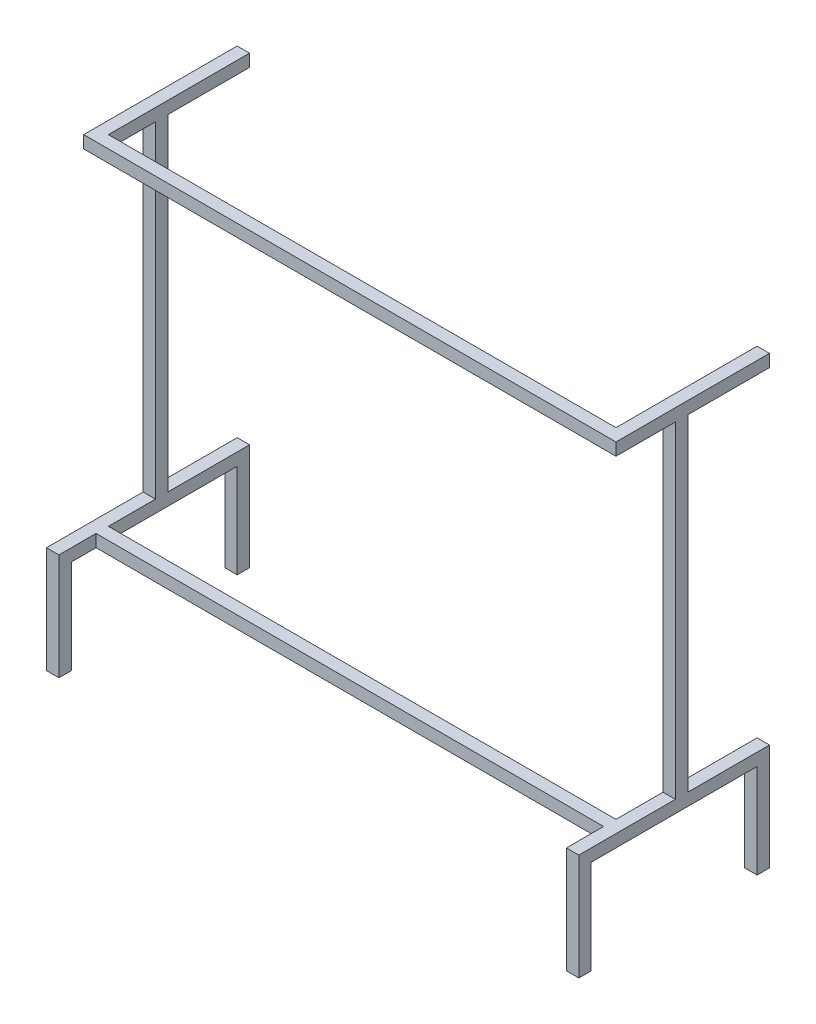
ISO-10303-21;
HEADER;
FILE_DESCRIPTION(('STEP AP214'),'2;1');
FILE_NAME('part.step','',(''),(''),'','','');
FILE_SCHEMA(('AUTOMOTIVE_DESIGN { 1 0 10303 214 1 1 1 1 }'));
ENDSEC;
DATA;
#1=APPLICATION_CONTEXT('core data for automotive mechanical design processes');
#2=APPLICATION_PROTOCOL_DEFINITION('international standard','automotive_design',2000,#1);
#3=PRODUCT_CONTEXT('',#1,'mechanical');
#4=PRODUCT('Part','Part','',(#3));
#5=PRODUCT_RELATED_PRODUCT_CATEGORY('part','',(#4));
#6=PRODUCT_DEFINITION_FORMATION('','',#4);
#7=PRODUCT_DEFINITION_CONTEXT('part definition',#1,'design');
#8=PRODUCT_DEFINITION('design','',#6,#7);
#9=PRODUCT_DEFINITION_SHAPE('','',#8);
#10=(LENGTH_UNIT() NAMED_UNIT(*) SI_UNIT(.MILLI.,.METRE.));
#11=(NAMED_UNIT(*) PLANE_ANGLE_UNIT() SI_UNIT($,.RADIAN.));
#12=(NAMED_UNIT(*) SI_UNIT($,.STERADIAN.) SOLID_ANGLE_UNIT());
#13=UNCERTAINTY_MEASURE_WITH_UNIT(LENGTH_MEASURE(1.E-05),#10,'distance_accuracy_value','');
#14=(GEOMETRIC_REPRESENTATION_CONTEXT(3) GLOBAL_UNCERTAINTY_ASSIGNED_CONTEXT((#13)) GLOBAL_UNIT_ASSIGNED_CONTEXT((#10,
#11,#12)) REPRESENTATION_CONTEXT('',''));
#15=CARTESIAN_POINT('',(0.,0.,0.));
#16=DIRECTION('',(0.,0.,1.));
#17=DIRECTION('',(1.,0.,0.));
#18=AXIS2_PLACEMENT_3D('',#15,#16,#17);
#19=CARTESIAN_POINT('',(0.,-355.,25.));
#20=DIRECTION('',(0.,1.,0.));
#21=DIRECTION('',(0.,0.,1.));
#22=AXIS2_PLACEMENT_3D('',#19,#20,#21);
#23=PLANE('',#22);
#24=DIRECTION('',(-1.,0.,0.));
#25=VECTOR('',#24,1.);
#26=CARTESIAN_POINT('',(512.5,-355.,-260.));
#27=LINE('',#26,#25);
#28=CARTESIAN_POINT('',(537.5,-355.,-260.));
#29=VERTEX_POINT('',#28);
#30=CARTESIAN_POINT('',(512.5,-355.,-260.));
#31=VERTEX_POINT('',#30);
#32=EDGE_CURVE('E297',#29,#31,#27,.T.);
#33=ORIENTED_EDGE('',*,*,#32,.F.);
#34=DIRECTION('',(0.,0.,-1.));
#35=VECTOR('',#34,1.);
#36=CARTESIAN_POINT('',(537.5,-355.,25.));
#37=LINE('',#36,#35);
#38=CARTESIAN_POINT('',(537.5,-355.,75.));
#39=VERTEX_POINT('',#38);
#40=EDGE_CURVE('E539',#39,#29,#37,.T.);
#41=ORIENTED_EDGE('',*,*,#40,.F.);
#42=DIRECTION('',(1.,0.,0.));
#43=VECTOR('',#42,1.);
#44=CARTESIAN_POINT('',(512.5,-355.,75.));
#45=LINE('',#44,#43);
#46=CARTESIAN_POINT('',(512.5,-355.,75.));
#47=VERTEX_POINT('',#46);
#48=EDGE_CURVE('E307',#47,#39,#45,.T.);
#49=ORIENTED_EDGE('',*,*,#48,.F.);
#50=DIRECTION('',(0.,0.,-1.));
#51=VECTOR('',#50,1.);
#52=CARTESIAN_POINT('',(512.5,-355.,100.));
#53=LINE('',#52,#51);
#54=CARTESIAN_POINT('',(512.5,-355.,25.));
#55=VERTEX_POINT('',#54);
#56=EDGE_CURVE('E367',#47,#55,#53,.T.);
#57=ORIENTED_EDGE('',*,*,#56,.T.);
#58=DIRECTION('',(1.,0.,0.));
#59=VECTOR('',#58,1.);
#60=CARTESIAN_POINT('',(0.,-355.,25.));
#61=LINE('',#60,#59);
#62=CARTESIAN_POINT('',(-512.5,-355.,25.));
#63=VERTEX_POINT('',#62);
#64=EDGE_CURVE('E529',#63,#55,#61,.T.);
#65=ORIENTED_EDGE('',*,*,#64,.F.);
#66=DIRECTION('',(0.,0.,-1.));
#67=VECTOR('',#66,1.);
#68=CARTESIAN_POINT('',(-512.5,-355.,100.));
#69=LINE('',#68,#67);
#70=CARTESIAN_POINT('',(-512.5,-355.,75.));
#71=VERTEX_POINT('',#70);
#72=EDGE_CURVE('E385',#71,#63,#69,.T.);
#73=ORIENTED_EDGE('',*,*,#72,.F.);
#74=DIRECTION('',(1.,0.,0.));
#75=VECTOR('',#74,1.);
#76=CARTESIAN_POINT('',(-537.5,-355.,75.));
#77=LINE('',#76,#75);
#78=CARTESIAN_POINT('',(-537.5,-355.,75.));
#79=VERTEX_POINT('',#78);
#80=EDGE_CURVE('E325',#79,#71,#77,.T.);
#81=ORIENTED_EDGE('',*,*,#80,.F.);
#82=DIRECTION('',(0.,0.,-1.));
#83=VECTOR('',#82,1.);
#84=CARTESIAN_POINT('',(-537.5,-355.,25.));
#85=LINE('',#84,#83);
#86=CARTESIAN_POINT('',(-537.5,-355.,-260.));
#87=VERTEX_POINT('',#86);
#88=EDGE_CURVE('E541',#79,#87,#85,.T.);
#89=ORIENTED_EDGE('',*,*,#88,.T.);
#90=DIRECTION('',(-1.,0.,0.));
#91=VECTOR('',#90,1.);
#92=CARTESIAN_POINT('',(-537.5,-355.,-260.));
#93=LINE('',#92,#91);
#94=CARTESIAN_POINT('',(-512.5,-355.,-260.));
#95=VERTEX_POINT('',#94);
#96=EDGE_CURVE('E50',#95,#87,#93,.T.);
#97=ORIENTED_EDGE('',*,*,#96,.F.);
#98=DIRECTION('',(0.,0.,1.));
#99=VECTOR('',#98,1.);
#100=CARTESIAN_POINT('',(-512.5,-355.,-285.));
#101=LINE('',#100,#99);
#102=CARTESIAN_POINT('',(-512.5,-355.,0.));
#103=VERTEX_POINT('',#102);
#104=EDGE_CURVE('E518',#95,#103,#101,.T.);
#105=ORIENTED_EDGE('',*,*,#104,.T.);
#106=DIRECTION('',(1.,0.,0.));
#107=VECTOR('',#106,1.);
#108=CARTESIAN_POINT('',(0.,-355.,0.));
#109=LINE('',#108,#107);
#110=CARTESIAN_POINT('',(512.5,-355.,0.));
#111=VERTEX_POINT('',#110);
#112=EDGE_CURVE('E530',#103,#111,#109,.T.);
#113=ORIENTED_EDGE('',*,*,#112,.T.);
#114=DIRECTION('',(0.,0.,1.));
#115=VECTOR('',#114,1.);
#116=CARTESIAN_POINT('',(512.5,-355.,-285.));
#117=LINE('',#116,#115);
#118=EDGE_CURVE('E508',#31,#111,#117,.T.);
#119=ORIENTED_EDGE('',*,*,#118,.F.);
#120=EDGE_LOOP('',(#33,#41,#49,#57,#65,#73,#81,#89,#97,#105,#113,#119));
#121=FACE_BOUND('',#120,.T.);
#122=ADVANCED_FACE('F35',(#121),#23,.F.);
#123=CARTESIAN_POINT('',(0.,0.,25.));
#124=DIRECTION('',(0.,0.,1.));
#125=DIRECTION('',(1.,0.,0.));
#126=AXIS2_PLACEMENT_3D('',#123,#124,#125);
#127=PLANE('',#126);
#128=ORIENTED_EDGE('',*,*,#64,.T.);
#129=DIRECTION('',(0.,-1.,0.));
#130=VECTOR('',#129,1.);
#131=CARTESIAN_POINT('',(512.5,-330.,25.));
#132=LINE('',#131,#130);
#133=CARTESIAN_POINT('',(512.5,-330.,25.));
#134=VERTEX_POINT('',#133);
#135=EDGE_CURVE('E58',#134,#55,#132,.T.);
#136=ORIENTED_EDGE('',*,*,#135,.F.);
#137=DIRECTION('',(1.,0.,0.));
#138=VECTOR('',#137,1.);
#139=CARTESIAN_POINT('',(0.,-330.,25.));
#140=LINE('',#139,#138);
#141=CARTESIAN_POINT('',(-512.5,-330.,25.));
#142=VERTEX_POINT('',#141);
#143=EDGE_CURVE('E527',#142,#134,#140,.T.);
#144=ORIENTED_EDGE('',*,*,#143,.F.);
#145=DIRECTION('',(0.,1.,0.));
#146=VECTOR('',#145,1.);
#147=CARTESIAN_POINT('',(-512.5,-330.,25.));
#148=LINE('',#147,#146);
#149=EDGE_CURVE('E373',#63,#142,#148,.T.);
#150=ORIENTED_EDGE('',*,*,#149,.F.);
#151=EDGE_LOOP('',(#128,#136,#144,#150));
#152=FACE_BOUND('',#151,.T.);
#153=ADVANCED_FACE('F599',(#152),#127,.T.);
#154=CARTESIAN_POINT('',(0.,-330.,25.));
#155=DIRECTION('',(0.,1.,0.));
#156=DIRECTION('',(0.,0.,1.));
#157=AXIS2_PLACEMENT_3D('',#154,#155,#156);
#158=PLANE('',#157);
#159=DIRECTION('',(0.,0.,1.));
#160=VECTOR('',#159,1.);
#161=CARTESIAN_POINT('',(512.5,-330.,-285.));
#162=LINE('',#161,#160);
#163=CARTESIAN_POINT('',(512.5,-330.,-285.));
#164=VERTEX_POINT('',#163);
#165=CARTESIAN_POINT('',(512.5,-330.,-120.));
#166=VERTEX_POINT('',#165);
#167=EDGE_CURVE('E278',#164,#166,#162,.T.);
#168=ORIENTED_EDGE('',*,*,#167,.T.);
#169=DIRECTION('',(-1.,0.,0.));
#170=VECTOR('',#169,1.);
#171=CARTESIAN_POINT('',(537.5,-330.,-120.));
#172=LINE('',#171,#170);
#173=CARTESIAN_POINT('',(537.5,-330.,-120.));
#174=VERTEX_POINT('',#173);
#175=EDGE_CURVE('E388',#174,#166,#172,.T.);
#176=ORIENTED_EDGE('',*,*,#175,.F.);
#177=DIRECTION('',(0.,0.,-1.));
#178=VECTOR('',#177,1.);
#179=CARTESIAN_POINT('',(537.5,-330.,25.));
#180=LINE('',#179,#178);
#181=CARTESIAN_POINT('',(537.5,-330.,-285.));
#182=VERTEX_POINT('',#181);
#183=EDGE_CURVE('E532',#174,#182,#180,.T.);
#184=ORIENTED_EDGE('',*,*,#183,.T.);
#185=DIRECTION('',(1.,0.,0.));
#186=VECTOR('',#185,1.);
#187=CARTESIAN_POINT('',(537.5,-330.,-285.));
#188=LINE('',#187,#186);
#189=EDGE_CURVE('E282',#164,#182,#188,.T.);
#190=ORIENTED_EDGE('',*,*,#189,.F.);
#191=EDGE_LOOP('',(#168,#176,#184,#190));
#192=FACE_BOUND('',#191,.T.);
#193=ADVANCED_FACE('F670',(#192),#158,.T.);
#194=CARTESIAN_POINT('',(537.5,-330.,100.));
#195=VERTEX_POINT('',#194);
#196=CARTESIAN_POINT('',(537.5,-330.,-95.));
#197=VERTEX_POINT('',#196);
#198=EDGE_CURVE('E537',#195,#197,#180,.T.);
#199=ORIENTED_EDGE('',*,*,#198,.T.);
#200=DIRECTION('',(1.,0.,0.));
#201=VECTOR('',#200,1.);
#202=CARTESIAN_POINT('',(537.5,-330.,-95.));
#203=LINE('',#202,#201);
#204=CARTESIAN_POINT('',(512.5,-330.,-95.));
#205=VERTEX_POINT('',#204);
#206=EDGE_CURVE('E387',#205,#197,#203,.T.);
#207=ORIENTED_EDGE('',*,*,#206,.F.);
#208=CARTESIAN_POINT('',(512.5,-330.,0.));
#209=VERTEX_POINT('',#208);
#210=EDGE_CURVE('E505',#205,#209,#162,.T.);
#211=ORIENTED_EDGE('',*,*,#210,.T.);
#212=DIRECTION('',(1.,0.,0.));
#213=VECTOR('',#212,1.);
#214=CARTESIAN_POINT('',(0.,-330.,0.));
#215=LINE('',#214,#213);
#216=CARTESIAN_POINT('',(-512.5,-330.,0.));
#217=VERTEX_POINT('',#216);
#218=EDGE_CURVE('E526',#217,#209,#215,.T.);
#219=ORIENTED_EDGE('',*,*,#218,.F.);
#220=DIRECTION('',(0.,0.,1.));
#221=VECTOR('',#220,1.);
#222=CARTESIAN_POINT('',(-512.5,-330.,-285.));
#223=LINE('',#222,#221);
#224=CARTESIAN_POINT('',(-512.5,-330.,-95.));
#225=VERTEX_POINT('',#224);
#226=EDGE_CURVE('E522',#225,#217,#223,.T.);
#227=ORIENTED_EDGE('',*,*,#226,.F.);
#228=DIRECTION('',(1.,0.,0.));
#229=VECTOR('',#228,1.);
#230=CARTESIAN_POINT('',(-512.5,-330.,-95.));
#231=LINE('',#230,#229);
#232=CARTESIAN_POINT('',(-537.5,-330.,-95.));
#233=VERTEX_POINT('',#232);
#234=EDGE_CURVE('E478',#233,#225,#231,.T.);
#235=ORIENTED_EDGE('',*,*,#234,.F.);
#236=DIRECTION('',(0.,0.,-1.));
#237=VECTOR('',#236,1.);
#238=CARTESIAN_POINT('',(-537.5,-330.,25.));
#239=LINE('',#238,#237);
#240=CARTESIAN_POINT('',(-537.5,-330.,100.));
#241=VERTEX_POINT('',#240);
#242=EDGE_CURVE('E11',#241,#233,#239,.T.);
#243=ORIENTED_EDGE('',*,*,#242,.F.);
#244=DIRECTION('',(-1.,0.,0.));
#245=VECTOR('',#244,1.);
#246=CARTESIAN_POINT('',(-537.5,-330.,100.));
#247=LINE('',#246,#245);
#248=CARTESIAN_POINT('',(-512.5,-330.,100.));
#249=VERTEX_POINT('',#248);
#250=EDGE_CURVE('E378',#249,#241,#247,.T.);
#251=ORIENTED_EDGE('',*,*,#250,.F.);
#252=DIRECTION('',(0.,0.,-1.));
#253=VECTOR('',#252,1.);
#254=CARTESIAN_POINT('',(-512.5,-330.,100.));
#255=LINE('',#254,#253);
#256=EDGE_CURVE('E381',#249,#142,#255,.T.);
#257=ORIENTED_EDGE('',*,*,#256,.T.);
#258=ORIENTED_EDGE('',*,*,#143,.T.);
#259=DIRECTION('',(0.,0.,-1.));
#260=VECTOR('',#259,1.);
#261=CARTESIAN_POINT('',(512.5,-330.,100.));
#262=LINE('',#261,#260);
#263=CARTESIAN_POINT('',(512.5,-330.,100.));
#264=VERTEX_POINT('',#263);
#265=EDGE_CURVE('E370',#264,#134,#262,.T.);
#266=ORIENTED_EDGE('',*,*,#265,.F.);
#267=DIRECTION('',(-1.,0.,0.));
#268=VECTOR('',#267,1.);
#269=CARTESIAN_POINT('',(537.5,-330.,100.));
#270=LINE('',#269,#268);
#271=EDGE_CURVE('E363',#195,#264,#270,.T.);
#272=ORIENTED_EDGE('',*,*,#271,.F.);
#273=EDGE_LOOP('',(#199,#207,#211,#219,#227,#235,#243,#251,#257,#258,#266,#272));
#274=FACE_BOUND('',#273,.T.);
#275=ADVANCED_FACE('F595',(#274),#158,.T.);
#276=CARTESIAN_POINT('',(0.,330.,25.));
#277=DIRECTION('',(0.,1.,0.));
#278=DIRECTION('',(0.,0.,1.));
#279=AXIS2_PLACEMENT_3D('',#276,#277,#278);
#280=PLANE('',#279);
#281=DIRECTION('',(-1.,0.,0.));
#282=VECTOR('',#281,1.);
#283=CARTESIAN_POINT('',(537.5,329.999999999984,-120.));
#284=LINE('',#283,#282);
#285=CARTESIAN_POINT('',(537.5,330.000000000098,-120.));
#286=VERTEX_POINT('',#285);
#287=CARTESIAN_POINT('',(512.5,330.000000000098,-120.));
#288=VERTEX_POINT('',#287);
#289=EDGE_CURVE('E404',#286,#288,#284,.T.);
#290=ORIENTED_EDGE('',*,*,#289,.T.);
#291=DIRECTION('',(0.,0.,1.));
#292=VECTOR('',#291,1.);
#293=CARTESIAN_POINT('',(512.5,330.,-285.));
#294=LINE('',#293,#292);
#295=CARTESIAN_POINT('',(512.5,330.,-285.));
#296=VERTEX_POINT('',#295);
#297=EDGE_CURVE('E447',#296,#288,#294,.T.);
#298=ORIENTED_EDGE('',*,*,#297,.F.);
#299=DIRECTION('',(-1.,0.,0.));
#300=VECTOR('',#299,1.);
#301=CARTESIAN_POINT('',(537.5,330.,-285.));
#302=LINE('',#301,#300);
#303=CARTESIAN_POINT('',(537.5,330.,-285.));
#304=VERTEX_POINT('',#303);
#305=EDGE_CURVE('E434',#304,#296,#302,.T.);
#306=ORIENTED_EDGE('',*,*,#305,.F.);
#307=DIRECTION('',(0.,0.,-1.));
#308=VECTOR('',#307,1.);
#309=CARTESIAN_POINT('',(537.5,330.,25.));
#310=LINE('',#309,#308);
#311=EDGE_CURVE('E474',#286,#304,#310,.T.);
#312=ORIENTED_EDGE('',*,*,#311,.F.);
#313=EDGE_LOOP('',(#290,#298,#306,#312));
#314=FACE_BOUND('',#313,.T.);
#315=ADVANCED_FACE('F664',(#314),#280,.F.);
#316=DIRECTION('',(1.,0.,0.));
#317=VECTOR('',#316,1.);
#318=CARTESIAN_POINT('',(537.5,329.999999999984,-95.));
#319=LINE('',#318,#317);
#320=CARTESIAN_POINT('',(512.5,330.,-95.));
#321=VERTEX_POINT('',#320);
#322=CARTESIAN_POINT('',(537.5,330.000000000098,-95.));
#323=VERTEX_POINT('',#322);
#324=EDGE_CURVE('E405',#321,#323,#319,.T.);
#325=ORIENTED_EDGE('',*,*,#324,.T.);
#326=CARTESIAN_POINT('',(537.5,330.,25.));
#327=VERTEX_POINT('',#326);
#328=EDGE_CURVE('E475',#327,#323,#310,.T.);
#329=ORIENTED_EDGE('',*,*,#328,.F.);
#330=DIRECTION('',(1.,0.,0.));
#331=VECTOR('',#330,1.);
#332=CARTESIAN_POINT('',(0.,330.,25.));
#333=LINE('',#332,#331);
#334=CARTESIAN_POINT('',(-537.5,330.,25.));
#335=VERTEX_POINT('',#334);
#336=EDGE_CURVE('E451',#335,#327,#333,.T.);
#337=ORIENTED_EDGE('',*,*,#336,.F.);
#338=DIRECTION('',(0.,0.,-1.));
#339=VECTOR('',#338,1.);
#340=CARTESIAN_POINT('',(-537.5,330.,25.));
#341=LINE('',#340,#339);
#342=CARTESIAN_POINT('',(-537.5,330.000000000098,-95.));
#343=VERTEX_POINT('',#342);
#344=EDGE_CURVE('E467',#335,#343,#341,.T.);
#345=ORIENTED_EDGE('',*,*,#344,.T.);
#346=DIRECTION('',(1.,0.,0.));
#347=VECTOR('',#346,1.);
#348=CARTESIAN_POINT('',(-512.5,329.999999999984,-95.));
#349=LINE('',#348,#347);
#350=CARTESIAN_POINT('',(-512.5,330.,-95.));
#351=VERTEX_POINT('',#350);
#352=EDGE_CURVE('E497',#343,#351,#349,.T.);
#353=ORIENTED_EDGE('',*,*,#352,.T.);
#354=DIRECTION('',(0.,0.,1.));
#355=VECTOR('',#354,1.);
#356=CARTESIAN_POINT('',(-512.5,330.,-285.));
#357=LINE('',#356,#355);
#358=CARTESIAN_POINT('',(-512.5,330.,0.));
#359=VERTEX_POINT('',#358);
#360=EDGE_CURVE('E421',#351,#359,#357,.T.);
#361=ORIENTED_EDGE('',*,*,#360,.T.);
#362=DIRECTION('',(1.,0.,0.));
#363=VECTOR('',#362,1.);
#364=CARTESIAN_POINT('',(0.,330.,0.));
#365=LINE('',#364,#363);
#366=CARTESIAN_POINT('',(512.5,330.,0.));
#367=VERTEX_POINT('',#366);
#368=EDGE_CURVE('E450',#359,#367,#365,.T.);
#369=ORIENTED_EDGE('',*,*,#368,.T.);
#370=EDGE_CURVE('E446',#321,#367,#294,.T.);
#371=ORIENTED_EDGE('',*,*,#370,.F.);
#372=EDGE_LOOP('',(#325,#329,#337,#345,#353,#361,#369,#371));
#373=FACE_BOUND('',#372,.T.);
#374=ADVANCED_FACE('F619',(#373),#280,.F.);
#375=CARTESIAN_POINT('',(0.,0.,0.));
#376=DIRECTION('',(0.,0.,1.));
#377=DIRECTION('',(1.,0.,0.));
#378=AXIS2_PLACEMENT_3D('',#375,#376,#377);
#379=PLANE('',#378);
#380=DIRECTION('',(0.,1.,0.));
#381=VECTOR('',#380,1.);
#382=CARTESIAN_POINT('',(512.5,-330.,0.));
#383=LINE('',#382,#381);
#384=EDGE_CURVE('E500',#111,#209,#383,.T.);
#385=ORIENTED_EDGE('',*,*,#384,.F.);
#386=ORIENTED_EDGE('',*,*,#112,.F.);
#387=DIRECTION('',(0.,-1.,0.));
#388=VECTOR('',#387,1.);
#389=CARTESIAN_POINT('',(-512.5,-330.,0.));
#390=LINE('',#389,#388);
#391=EDGE_CURVE('E510',#217,#103,#390,.T.);
#392=ORIENTED_EDGE('',*,*,#391,.F.);
#393=ORIENTED_EDGE('',*,*,#218,.T.);
#394=EDGE_LOOP('',(#385,#386,#392,#393));
#395=FACE_BOUND('',#394,.T.);
#396=ADVANCED_FACE('F572',(#395),#379,.F.);
#397=DIRECTION('',(-1.,0.,0.));
#398=VECTOR('',#397,1.);
#399=CARTESIAN_POINT('',(-512.5,-330.,-120.));
#400=LINE('',#399,#398);
#401=CARTESIAN_POINT('',(-512.5,-330.,-120.));
#402=VERTEX_POINT('',#401);
#403=CARTESIAN_POINT('',(-537.5,-330.,-120.));
#404=VERTEX_POINT('',#403);
#405=EDGE_CURVE('E479',#402,#404,#400,.T.);
#406=ORIENTED_EDGE('',*,*,#405,.F.);
#407=CARTESIAN_POINT('',(-512.5,-330.,-285.));
#408=VERTEX_POINT('',#407);
#409=EDGE_CURVE('E523',#408,#402,#223,.T.);
#410=ORIENTED_EDGE('',*,*,#409,.F.);
#411=DIRECTION('',(1.,0.,0.));
#412=VECTOR('',#411,1.);
#413=CARTESIAN_POINT('',(-537.5,-330.,-285.));
#414=LINE('',#413,#412);
#415=CARTESIAN_POINT('',(-537.5,-330.,-285.));
#416=VERTEX_POINT('',#415);
#417=EDGE_CURVE('E514',#416,#408,#414,.T.);
#418=ORIENTED_EDGE('',*,*,#417,.F.);
#419=EDGE_CURVE('E43',#404,#416,#239,.T.);
#420=ORIENTED_EDGE('',*,*,#419,.F.);
#421=EDGE_LOOP('',(#406,#410,#418,#420));
#422=FACE_BOUND('',#421,.T.);
#423=ADVANCED_FACE('F37',(#422),#158,.T.);
#424=CARTESIAN_POINT('',(-537.5,0.,25.));
#425=DIRECTION('',(-1.,0.,0.));
#426=DIRECTION('',(0.,0.,1.));
#427=AXIS2_PLACEMENT_3D('',#424,#425,#426);
#428=PLANE('',#427);
#429=ORIENTED_EDGE('',*,*,#242,.T.);
#430=DIRECTION('',(0.,-1.,0.));
#431=VECTOR('',#430,1.);
#432=CARTESIAN_POINT('',(-537.5,500000.,-95.));
#433=LINE('',#432,#431);
#434=EDGE_CURVE('E487',#343,#233,#433,.T.);
#435=ORIENTED_EDGE('',*,*,#434,.F.);
#436=ORIENTED_EDGE('',*,*,#344,.F.);
#437=DIRECTION('',(0.,1.,0.));
#438=VECTOR('',#437,1.);
#439=CARTESIAN_POINT('',(-537.5,0.,25.));
#440=LINE('',#439,#438);
#441=CARTESIAN_POINT('',(-537.5,355.,25.));
#442=VERTEX_POINT('',#441);
#443=EDGE_CURVE('E460',#335,#442,#440,.T.);
#444=ORIENTED_EDGE('',*,*,#443,.T.);
#445=DIRECTION('',(0.,0.,-1.));
#446=VECTOR('',#445,1.);
#447=CARTESIAN_POINT('',(-537.5,355.,25.));
#448=LINE('',#447,#446);
#449=CARTESIAN_POINT('',(-537.5,355.,-285.));
#450=VERTEX_POINT('',#449);
#451=EDGE_CURVE('E470',#442,#450,#448,.T.);
#452=ORIENTED_EDGE('',*,*,#451,.T.);
#453=DIRECTION('',(0.,1.,0.));
#454=VECTOR('',#453,1.);
#455=CARTESIAN_POINT('',(-537.5,355.,-285.));
#456=LINE('',#455,#454);
#457=CARTESIAN_POINT('',(-537.5,330.,-285.));
#458=VERTEX_POINT('',#457);
#459=EDGE_CURVE('E411',#458,#450,#456,.T.);
#460=ORIENTED_EDGE('',*,*,#459,.F.);
#461=CARTESIAN_POINT('',(-537.5,330.000000000098,-120.));
#462=VERTEX_POINT('',#461);
#463=EDGE_CURVE('E463',#462,#458,#341,.T.);
#464=ORIENTED_EDGE('',*,*,#463,.F.);
#465=DIRECTION('',(0.,-1.,0.));
#466=VECTOR('',#465,1.);
#467=CARTESIAN_POINT('',(-537.5,500000.,-120.));
#468=LINE('',#467,#466);
#469=EDGE_CURVE('E490',#462,#404,#468,.T.);
#470=ORIENTED_EDGE('',*,*,#469,.T.);
#471=ORIENTED_EDGE('',*,*,#419,.T.);
#472=DIRECTION('',(0.,1.,0.));
#473=VECTOR('',#472,1.);
#474=CARTESIAN_POINT('',(-537.5,-330.,-285.));
#475=LINE('',#474,#473);
#476=CARTESIAN_POINT('',(-537.5,-545.,-285.));
#477=VERTEX_POINT('',#476);
#478=EDGE_CURVE('E511',#477,#416,#475,.T.);
#479=ORIENTED_EDGE('',*,*,#478,.F.);
#480=DIRECTION('',(0.,0.,-1.));
#481=VECTOR('',#480,1.);
#482=CARTESIAN_POINT('',(-537.5,-545.,-285.));
#483=LINE('',#482,#481);
#484=CARTESIAN_POINT('',(-537.5,-545.,-260.));
#485=VERTEX_POINT('',#484);
#486=EDGE_CURVE('E343',#485,#477,#483,.T.);
#487=ORIENTED_EDGE('',*,*,#486,.F.);
#488=DIRECTION('',(0.,1.,0.));
#489=VECTOR('',#488,1.);
#490=CARTESIAN_POINT('',(-537.5,-545.,-260.));
#491=LINE('',#490,#489);
#492=EDGE_CURVE('E353',#485,#87,#491,.T.);
#493=ORIENTED_EDGE('',*,*,#492,.T.);
#494=ORIENTED_EDGE('',*,*,#88,.F.);
#495=DIRECTION('',(0.,1.,0.));
#496=VECTOR('',#495,1.);
#497=CARTESIAN_POINT('',(-537.5,-545.,75.));
#498=LINE('',#497,#496);
#499=CARTESIAN_POINT('',(-537.5,-545.,75.));
#500=VERTEX_POINT('',#499);
#501=EDGE_CURVE('E341',#500,#79,#498,.T.);
#502=ORIENTED_EDGE('',*,*,#501,.F.);
#503=DIRECTION('',(0.,0.,-1.));
#504=VECTOR('',#503,1.);
#505=CARTESIAN_POINT('',(-537.5,-545.,100.));
#506=LINE('',#505,#504);
#507=CARTESIAN_POINT('',(-537.5,-545.,100.));
#508=VERTEX_POINT('',#507);
#509=EDGE_CURVE('E326',#508,#500,#506,.T.);
#510=ORIENTED_EDGE('',*,*,#509,.F.);
#511=DIRECTION('',(0.,-1.,0.));
#512=VECTOR('',#511,1.);
#513=CARTESIAN_POINT('',(-537.5,-330.,100.));
#514=LINE('',#513,#512);
#515=EDGE_CURVE('E374',#241,#508,#514,.T.);
#516=ORIENTED_EDGE('',*,*,#515,.F.);
#517=EDGE_LOOP('',(#429,#435,#436,#444,#452,#460,#464,#470,#471,#479,#487,#493,#494,#502,#510,#516));
#518=FACE_BOUND('',#517,.T.);
#519=ADVANCED_FACE('F546',(#518),#428,.T.);
#520=CARTESIAN_POINT('',(537.5,0.,25.));
#521=DIRECTION('',(-1.,0.,0.));
#522=DIRECTION('',(0.,0.,1.));
#523=AXIS2_PLACEMENT_3D('',#520,#521,#522);
#524=PLANE('',#523);
#525=DIRECTION('',(0.,1.,0.));
#526=VECTOR('',#525,1.);
#527=CARTESIAN_POINT('',(537.5,-330.,100.));
#528=LINE('',#527,#526);
#529=CARTESIAN_POINT('',(537.5,-545.,100.));
#530=VERTEX_POINT('',#529);
#531=EDGE_CURVE('E360',#530,#195,#528,.T.);
#532=ORIENTED_EDGE('',*,*,#531,.F.);
#533=DIRECTION('',(0.,0.,1.));
#534=VECTOR('',#533,1.);
#535=CARTESIAN_POINT('',(537.5,-545.,100.));
#536=LINE('',#535,#534);
#537=CARTESIAN_POINT('',(537.5,-545.,75.));
#538=VERTEX_POINT('',#537);
#539=EDGE_CURVE('E313',#538,#530,#536,.T.);
#540=ORIENTED_EDGE('',*,*,#539,.F.);
#541=DIRECTION('',(0.,1.,0.));
#542=VECTOR('',#541,1.);
#543=CARTESIAN_POINT('',(537.5,-545.,75.));
#544=LINE('',#543,#542);
#545=EDGE_CURVE('E319',#538,#39,#544,.T.);
#546=ORIENTED_EDGE('',*,*,#545,.T.);
#547=ORIENTED_EDGE('',*,*,#40,.T.);
#548=DIRECTION('',(0.,1.,0.));
#549=VECTOR('',#548,1.);
#550=CARTESIAN_POINT('',(537.5,-545.,-260.));
#551=LINE('',#550,#549);
#552=CARTESIAN_POINT('',(537.5,-545.,-260.));
#553=VERTEX_POINT('',#552);
#554=EDGE_CURVE('E305',#553,#29,#551,.T.);
#555=ORIENTED_EDGE('',*,*,#554,.F.);
#556=DIRECTION('',(0.,0.,1.));
#557=VECTOR('',#556,1.);
#558=CARTESIAN_POINT('',(537.5,-545.,-285.));
#559=LINE('',#558,#557);
#560=CARTESIAN_POINT('',(537.5,-545.,-285.));
#561=VERTEX_POINT('',#560);
#562=EDGE_CURVE('E291',#561,#553,#559,.T.);
#563=ORIENTED_EDGE('',*,*,#562,.F.);
#564=DIRECTION('',(0.,-1.,0.));
#565=VECTOR('',#564,1.);
#566=CARTESIAN_POINT('',(537.5,-330.,-285.));
#567=LINE('',#566,#565);
#568=EDGE_CURVE('E283',#182,#561,#567,.T.);
#569=ORIENTED_EDGE('',*,*,#568,.F.);
#570=ORIENTED_EDGE('',*,*,#183,.F.);
#571=DIRECTION('',(0.,-1.,0.));
#572=VECTOR('',#571,1.);
#573=CARTESIAN_POINT('',(537.5,500000.,-120.));
#574=LINE('',#573,#572);
#575=EDGE_CURVE('E401',#286,#174,#574,.T.);
#576=ORIENTED_EDGE('',*,*,#575,.F.);
#577=ORIENTED_EDGE('',*,*,#311,.T.);
#578=DIRECTION('',(0.,-1.,0.));
#579=VECTOR('',#578,1.);
#580=CARTESIAN_POINT('',(537.5,355.,-285.));
#581=LINE('',#580,#579);
#582=CARTESIAN_POINT('',(537.5,355.,-285.));
#583=VERTEX_POINT('',#582);
#584=EDGE_CURVE('E431',#583,#304,#581,.T.);
#585=ORIENTED_EDGE('',*,*,#584,.F.);
#586=DIRECTION('',(0.,0.,-1.));
#587=VECTOR('',#586,1.);
#588=CARTESIAN_POINT('',(537.5,355.,25.));
#589=LINE('',#588,#587);
#590=CARTESIAN_POINT('',(537.5,355.,25.));
#591=VERTEX_POINT('',#590);
#592=EDGE_CURVE('E472',#591,#583,#589,.T.);
#593=ORIENTED_EDGE('',*,*,#592,.F.);
#594=DIRECTION('',(0.,1.,0.));
#595=VECTOR('',#594,1.);
#596=CARTESIAN_POINT('',(537.5,0.,25.));
#597=LINE('',#596,#595);
#598=EDGE_CURVE('E454',#327,#591,#597,.T.);
#599=ORIENTED_EDGE('',*,*,#598,.F.);
#600=ORIENTED_EDGE('',*,*,#328,.T.);
#601=DIRECTION('',(0.,-1.,0.));
#602=VECTOR('',#601,1.);
#603=CARTESIAN_POINT('',(537.5,500000.,-95.));
#604=LINE('',#603,#602);
#605=EDGE_CURVE('E391',#323,#197,#604,.T.);
#606=ORIENTED_EDGE('',*,*,#605,.T.);
#607=ORIENTED_EDGE('',*,*,#198,.F.);
#608=EDGE_LOOP('',(#532,#540,#546,#547,#555,#563,#569,#570,#576,#577,#585,#593,#599,#600,#606,#607));
#609=FACE_BOUND('',#608,.T.);
#610=ADVANCED_FACE('F580',(#609),#524,.F.);
#611=CARTESIAN_POINT('',(-512.5,-330.,-285.));
#612=DIRECTION('',(-1.,0.,0.));
#613=DIRECTION('',(0.,0.,1.));
#614=AXIS2_PLACEMENT_3D('',#611,#612,#613);
#615=PLANE('',#614);
#616=ORIENTED_EDGE('',*,*,#391,.T.);
#617=ORIENTED_EDGE('',*,*,#104,.F.);
#618=DIRECTION('',(0.,1.,0.));
#619=VECTOR('',#618,1.);
#620=CARTESIAN_POINT('',(-512.5,-545.,-260.));
#621=LINE('',#620,#619);
#622=CARTESIAN_POINT('',(-512.5,-545.,-260.));
#623=VERTEX_POINT('',#622);
#624=EDGE_CURVE('E357',#623,#95,#621,.T.);
#625=ORIENTED_EDGE('',*,*,#624,.F.);
#626=DIRECTION('',(0.,0.,1.));
#627=VECTOR('',#626,1.);
#628=CARTESIAN_POINT('',(-512.5,-545.,-285.));
#629=LINE('',#628,#627);
#630=CARTESIAN_POINT('',(-512.5,-545.,-285.));
#631=VERTEX_POINT('',#630);
#632=EDGE_CURVE('E349',#631,#623,#629,.T.);
#633=ORIENTED_EDGE('',*,*,#632,.F.);
#634=DIRECTION('',(0.,-1.,0.));
#635=VECTOR('',#634,1.);
#636=CARTESIAN_POINT('',(-512.5,-330.,-285.));
#637=LINE('',#636,#635);
#638=EDGE_CURVE('E516',#408,#631,#637,.T.);
#639=ORIENTED_EDGE('',*,*,#638,.F.);
#640=ORIENTED_EDGE('',*,*,#409,.T.);
#641=DIRECTION('',(0.,-1.,0.));
#642=VECTOR('',#641,1.);
#643=CARTESIAN_POINT('',(-512.5,500000.,-120.));
#644=LINE('',#643,#642);
#645=CARTESIAN_POINT('',(-512.5,330.000000000098,-120.));
#646=VERTEX_POINT('',#645);
#647=EDGE_CURVE('E493',#646,#402,#644,.T.);
#648=ORIENTED_EDGE('',*,*,#647,.F.);
#649=CARTESIAN_POINT('',(-512.5,330.,-285.));
#650=VERTEX_POINT('',#649);
#651=EDGE_CURVE('E424',#650,#646,#357,.T.);
#652=ORIENTED_EDGE('',*,*,#651,.F.);
#653=DIRECTION('',(0.,-1.,0.));
#654=VECTOR('',#653,1.);
#655=CARTESIAN_POINT('',(-512.5,355.,-285.));
#656=LINE('',#655,#654);
#657=CARTESIAN_POINT('',(-512.5,355.,-285.));
#658=VERTEX_POINT('',#657);
#659=EDGE_CURVE('E416',#658,#650,#656,.T.);
#660=ORIENTED_EDGE('',*,*,#659,.F.);
#661=DIRECTION('',(0.,0.,1.));
#662=VECTOR('',#661,1.);
#663=CARTESIAN_POINT('',(-512.5,355.,-285.));
#664=LINE('',#663,#662);
#665=CARTESIAN_POINT('',(-512.5,355.,0.));
#666=VERTEX_POINT('',#665);
#667=EDGE_CURVE('E427',#658,#666,#664,.T.);
#668=ORIENTED_EDGE('',*,*,#667,.T.);
#669=DIRECTION('',(0.,-1.,0.));
#670=VECTOR('',#669,1.);
#671=CARTESIAN_POINT('',(-512.5,355.,0.));
#672=LINE('',#671,#670);
#673=EDGE_CURVE('E408',#666,#359,#672,.T.);
#674=ORIENTED_EDGE('',*,*,#673,.T.);
#675=ORIENTED_EDGE('',*,*,#360,.F.);
#676=DIRECTION('',(0.,-1.,0.));
#677=VECTOR('',#676,1.);
#678=CARTESIAN_POINT('',(-512.5,500000.,-95.));
#679=LINE('',#678,#677);
#680=EDGE_CURVE('E482',#351,#225,#679,.T.);
#681=ORIENTED_EDGE('',*,*,#680,.T.);
#682=ORIENTED_EDGE('',*,*,#226,.T.);
#683=EDGE_LOOP('',(#616,#617,#625,#633,#639,#640,#648,#652,#660,#668,#674,#675,#681,#682));
#684=FACE_BOUND('',#683,.T.);
#685=ADVANCED_FACE('F565',(#684),#615,.F.);
#686=CARTESIAN_POINT('',(0.,0.,-285.));
#687=DIRECTION('',(0.,0.,1.));
#688=DIRECTION('',(1.,0.,0.));
#689=AXIS2_PLACEMENT_3D('',#686,#687,#688);
#690=PLANE('',#689);
#691=ORIENTED_EDGE('',*,*,#478,.T.);
#692=ORIENTED_EDGE('',*,*,#417,.T.);
#693=ORIENTED_EDGE('',*,*,#638,.T.);
#694=DIRECTION('',(1.,0.,0.));
#695=VECTOR('',#694,1.);
#696=CARTESIAN_POINT('',(-537.5,-545.,-285.));
#697=LINE('',#696,#695);
#698=EDGE_CURVE('E346',#477,#631,#697,.T.);
#699=ORIENTED_EDGE('',*,*,#698,.F.);
#700=EDGE_LOOP('',(#691,#692,#693,#699));
#701=FACE_BOUND('',#700,.T.);
#702=ADVANCED_FACE('F554',(#701),#690,.F.);
#703=CARTESIAN_POINT('',(512.5,-330.,-285.));
#704=DIRECTION('',(1.,0.,0.));
#705=DIRECTION('',(0.,0.,-1.));
#706=AXIS2_PLACEMENT_3D('',#703,#704,#705);
#707=PLANE('',#706);
#708=ORIENTED_EDGE('',*,*,#384,.T.);
#709=ORIENTED_EDGE('',*,*,#210,.F.);
#710=DIRECTION('',(0.,-1.,0.));
#711=VECTOR('',#710,1.);
#712=CARTESIAN_POINT('',(512.5,500000.,-95.));
#713=LINE('',#712,#711);
#714=EDGE_CURVE('E396',#321,#205,#713,.T.);
#715=ORIENTED_EDGE('',*,*,#714,.F.);
#716=ORIENTED_EDGE('',*,*,#370,.T.);
#717=DIRECTION('',(0.,1.,0.));
#718=VECTOR('',#717,1.);
#719=CARTESIAN_POINT('',(512.5,355.,0.));
#720=LINE('',#719,#718);
#721=CARTESIAN_POINT('',(512.5,355.,0.));
#722=VERTEX_POINT('',#721);
#723=EDGE_CURVE('E430',#367,#722,#720,.T.);
#724=ORIENTED_EDGE('',*,*,#723,.T.);
#725=DIRECTION('',(0.,0.,1.));
#726=VECTOR('',#725,1.);
#727=CARTESIAN_POINT('',(512.5,355.,-285.));
#728=LINE('',#727,#726);
#729=CARTESIAN_POINT('',(512.5,355.,-285.));
#730=VERTEX_POINT('',#729);
#731=EDGE_CURVE('E441',#730,#722,#728,.T.);
#732=ORIENTED_EDGE('',*,*,#731,.F.);
#733=DIRECTION('',(0.,1.,0.));
#734=VECTOR('',#733,1.);
#735=CARTESIAN_POINT('',(512.5,355.,-285.));
#736=LINE('',#735,#734);
#737=EDGE_CURVE('E436',#296,#730,#736,.T.);
#738=ORIENTED_EDGE('',*,*,#737,.F.);
#739=ORIENTED_EDGE('',*,*,#297,.T.);
#740=DIRECTION('',(0.,-1.,0.));
#741=VECTOR('',#740,1.);
#742=CARTESIAN_POINT('',(512.5,500000.,-120.));
#743=LINE('',#742,#741);
#744=EDGE_CURVE('E399',#288,#166,#743,.T.);
#745=ORIENTED_EDGE('',*,*,#744,.T.);
#746=ORIENTED_EDGE('',*,*,#167,.F.);
#747=DIRECTION('',(0.,1.,0.));
#748=VECTOR('',#747,1.);
#749=CARTESIAN_POINT('',(512.5,-330.,-285.));
#750=LINE('',#749,#748);
#751=CARTESIAN_POINT('',(512.5,-545.,-285.));
#752=VERTEX_POINT('',#751);
#753=EDGE_CURVE('E270',#752,#164,#750,.T.);
#754=ORIENTED_EDGE('',*,*,#753,.F.);
#755=DIRECTION('',(0.,0.,-1.));
#756=VECTOR('',#755,1.);
#757=CARTESIAN_POINT('',(512.5,-545.,-285.));
#758=LINE('',#757,#756);
#759=CARTESIAN_POINT('',(512.5,-545.,-260.));
#760=VERTEX_POINT('',#759);
#761=EDGE_CURVE('E276',#760,#752,#758,.T.);
#762=ORIENTED_EDGE('',*,*,#761,.F.);
#763=DIRECTION('',(0.,1.,0.));
#764=VECTOR('',#763,1.);
#765=CARTESIAN_POINT('',(512.5,-545.,-260.));
#766=LINE('',#765,#764);
#767=EDGE_CURVE('E302',#760,#31,#766,.T.);
#768=ORIENTED_EDGE('',*,*,#767,.T.);
#769=ORIENTED_EDGE('',*,*,#118,.T.);
#770=EDGE_LOOP('',(#708,#709,#715,#716,#724,#732,#738,#739,#745,#746,#754,#762,#768,#769));
#771=FACE_BOUND('',#770,.T.);
#772=ADVANCED_FACE('F273',(#771),#707,.F.);
#773=CARTESIAN_POINT('',(0.,0.,-285.));
#774=DIRECTION('',(0.,0.,-1.));
#775=DIRECTION('',(-1.,0.,0.));
#776=AXIS2_PLACEMENT_3D('',#773,#774,#775);
#777=PLANE('',#776);
#778=ORIENTED_EDGE('',*,*,#568,.T.);
#779=DIRECTION('',(1.,0.,0.));
#780=VECTOR('',#779,1.);
#781=CARTESIAN_POINT('',(512.5,-545.,-285.));
#782=LINE('',#781,#780);
#783=EDGE_CURVE('E286',#752,#561,#782,.T.);
#784=ORIENTED_EDGE('',*,*,#783,.F.);
#785=ORIENTED_EDGE('',*,*,#753,.T.);
#786=ORIENTED_EDGE('',*,*,#189,.T.);
#787=EDGE_LOOP('',(#778,#784,#785,#786));
#788=FACE_BOUND('',#787,.T.);
#789=ADVANCED_FACE('F287',(#788),#777,.T.);
#790=CARTESIAN_POINT('',(-512.5,500000.,-120.));
#791=DIRECTION('',(0.,0.,1.));
#792=DIRECTION('',(1.,0.,0.));
#793=AXIS2_PLACEMENT_3D('',#790,#791,#792);
#794=PLANE('',#793);
#795=DIRECTION('',(-1.,0.,0.));
#796=VECTOR('',#795,1.);
#797=CARTESIAN_POINT('',(-512.5,329.999999999984,-120.));
#798=LINE('',#797,#796);
#799=EDGE_CURVE('E496',#646,#462,#798,.T.);
#800=ORIENTED_EDGE('',*,*,#799,.F.);
#801=ORIENTED_EDGE('',*,*,#647,.T.);
#802=ORIENTED_EDGE('',*,*,#405,.T.);
#803=ORIENTED_EDGE('',*,*,#469,.F.);
#804=EDGE_LOOP('',(#800,#801,#802,#803));
#805=FACE_BOUND('',#804,.T.);
#806=ADVANCED_FACE('F653',(#805),#794,.F.);
#807=CARTESIAN_POINT('',(-512.5,500000.,-95.));
#808=DIRECTION('',(0.,0.,-1.));
#809=DIRECTION('',(-1.,0.,0.));
#810=AXIS2_PLACEMENT_3D('',#807,#808,#809);
#811=PLANE('',#810);
#812=ORIENTED_EDGE('',*,*,#352,.F.);
#813=ORIENTED_EDGE('',*,*,#434,.T.);
#814=ORIENTED_EDGE('',*,*,#234,.T.);
#815=ORIENTED_EDGE('',*,*,#680,.F.);
#816=EDGE_LOOP('',(#812,#813,#814,#815));
#817=FACE_BOUND('',#816,.T.);
#818=ADVANCED_FACE('F616',(#817),#811,.F.);
#819=ORIENTED_EDGE('',*,*,#651,.T.);
#820=ORIENTED_EDGE('',*,*,#799,.T.);
#821=ORIENTED_EDGE('',*,*,#463,.T.);
#822=DIRECTION('',(-1.,0.,0.));
#823=VECTOR('',#822,1.);
#824=CARTESIAN_POINT('',(-537.5,330.,-285.));
#825=LINE('',#824,#823);
#826=EDGE_CURVE('E418',#650,#458,#825,.T.);
#827=ORIENTED_EDGE('',*,*,#826,.F.);
#828=EDGE_LOOP('',(#819,#820,#821,#827));
#829=FACE_BOUND('',#828,.T.);
#830=ADVANCED_FACE('F650',(#829),#280,.F.);
#831=CARTESIAN_POINT('',(0.,0.,0.));
#832=DIRECTION('',(0.,0.,1.));
#833=DIRECTION('',(1.,0.,0.));
#834=AXIS2_PLACEMENT_3D('',#831,#832,#833);
#835=PLANE('',#834);
#836=ORIENTED_EDGE('',*,*,#673,.F.);
#837=DIRECTION('',(1.,0.,0.));
#838=VECTOR('',#837,1.);
#839=CARTESIAN_POINT('',(0.,355.,0.));
#840=LINE('',#839,#838);
#841=EDGE_CURVE('E455',#666,#722,#840,.T.);
#842=ORIENTED_EDGE('',*,*,#841,.T.);
#843=ORIENTED_EDGE('',*,*,#723,.F.);
#844=ORIENTED_EDGE('',*,*,#368,.F.);
#845=EDGE_LOOP('',(#836,#842,#843,#844));
#846=FACE_BOUND('',#845,.T.);
#847=ADVANCED_FACE('F626',(#846),#835,.F.);
#848=CARTESIAN_POINT('',(0.,355.,25.));
#849=DIRECTION('',(0.,1.,0.));
#850=DIRECTION('',(0.,0.,1.));
#851=AXIS2_PLACEMENT_3D('',#848,#849,#850);
#852=PLANE('',#851);
#853=ORIENTED_EDGE('',*,*,#841,.F.);
#854=ORIENTED_EDGE('',*,*,#667,.F.);
#855=DIRECTION('',(1.,0.,0.));
#856=VECTOR('',#855,1.);
#857=CARTESIAN_POINT('',(-537.5,355.,-285.));
#858=LINE('',#857,#856);
#859=EDGE_CURVE('E414',#450,#658,#858,.T.);
#860=ORIENTED_EDGE('',*,*,#859,.F.);
#861=ORIENTED_EDGE('',*,*,#451,.F.);
#862=DIRECTION('',(1.,0.,0.));
#863=VECTOR('',#862,1.);
#864=CARTESIAN_POINT('',(0.,355.,25.));
#865=LINE('',#864,#863);
#866=EDGE_CURVE('E457',#442,#591,#865,.T.);
#867=ORIENTED_EDGE('',*,*,#866,.T.);
#868=ORIENTED_EDGE('',*,*,#592,.T.);
#869=DIRECTION('',(1.,0.,0.));
#870=VECTOR('',#869,1.);
#871=CARTESIAN_POINT('',(537.5,355.,-285.));
#872=LINE('',#871,#870);
#873=EDGE_CURVE('E438',#730,#583,#872,.T.);
#874=ORIENTED_EDGE('',*,*,#873,.F.);
#875=ORIENTED_EDGE('',*,*,#731,.T.);
#876=EDGE_LOOP('',(#853,#854,#860,#861,#867,#868,#874,#875));
#877=FACE_BOUND('',#876,.T.);
#878=ADVANCED_FACE('F629',(#877),#852,.T.);
#879=CARTESIAN_POINT('',(0.,0.,25.));
#880=DIRECTION('',(0.,0.,1.));
#881=DIRECTION('',(1.,0.,0.));
#882=AXIS2_PLACEMENT_3D('',#879,#880,#881);
#883=PLANE('',#882);
#884=ORIENTED_EDGE('',*,*,#336,.T.);
#885=ORIENTED_EDGE('',*,*,#598,.T.);
#886=ORIENTED_EDGE('',*,*,#866,.F.);
#887=ORIENTED_EDGE('',*,*,#443,.F.);
#888=EDGE_LOOP('',(#884,#885,#886,#887));
#889=FACE_BOUND('',#888,.T.);
#890=ADVANCED_FACE('F643',(#889),#883,.T.);
#891=CARTESIAN_POINT('',(0.,0.,-285.));
#892=DIRECTION('',(0.,0.,-1.));
#893=DIRECTION('',(-1.,0.,0.));
#894=AXIS2_PLACEMENT_3D('',#891,#892,#893);
#895=PLANE('',#894);
#896=ORIENTED_EDGE('',*,*,#584,.T.);
#897=ORIENTED_EDGE('',*,*,#305,.T.);
#898=ORIENTED_EDGE('',*,*,#737,.T.);
#899=ORIENTED_EDGE('',*,*,#873,.T.);
#900=EDGE_LOOP('',(#896,#897,#898,#899));
#901=FACE_BOUND('',#900,.T.);
#902=ADVANCED_FACE('F699',(#901),#895,.T.);
#903=CARTESIAN_POINT('',(0.,0.,-285.));
#904=DIRECTION('',(0.,0.,1.));
#905=DIRECTION('',(1.,0.,0.));
#906=AXIS2_PLACEMENT_3D('',#903,#904,#905);
#907=PLANE('',#906);
#908=ORIENTED_EDGE('',*,*,#459,.T.);
#909=ORIENTED_EDGE('',*,*,#859,.T.);
#910=ORIENTED_EDGE('',*,*,#659,.T.);
#911=ORIENTED_EDGE('',*,*,#826,.T.);
#912=EDGE_LOOP('',(#908,#909,#910,#911));
#913=FACE_BOUND('',#912,.T.);
#914=ADVANCED_FACE('F646',(#913),#907,.F.);
#915=CARTESIAN_POINT('',(537.5,500000.,-120.));
#916=DIRECTION('',(0.,0.,1.));
#917=DIRECTION('',(1.,0.,0.));
#918=AXIS2_PLACEMENT_3D('',#915,#916,#917);
#919=PLANE('',#918);
#920=ORIENTED_EDGE('',*,*,#289,.F.);
#921=ORIENTED_EDGE('',*,*,#575,.T.);
#922=ORIENTED_EDGE('',*,*,#175,.T.);
#923=ORIENTED_EDGE('',*,*,#744,.F.);
#924=EDGE_LOOP('',(#920,#921,#922,#923));
#925=FACE_BOUND('',#924,.T.);
#926=ADVANCED_FACE('F705',(#925),#919,.F.);
#927=CARTESIAN_POINT('',(537.5,500000.,-95.));
#928=DIRECTION('',(0.,0.,-1.));
#929=DIRECTION('',(-1.,0.,0.));
#930=AXIS2_PLACEMENT_3D('',#927,#928,#929);
#931=PLANE('',#930);
#932=ORIENTED_EDGE('',*,*,#324,.F.);
#933=ORIENTED_EDGE('',*,*,#714,.T.);
#934=ORIENTED_EDGE('',*,*,#206,.T.);
#935=ORIENTED_EDGE('',*,*,#605,.F.);
#936=EDGE_LOOP('',(#932,#933,#934,#935));
#937=FACE_BOUND('',#936,.T.);
#938=ADVANCED_FACE('F706',(#937),#931,.F.);
#939=CARTESIAN_POINT('',(-512.5,-330.,100.));
#940=DIRECTION('',(-1.,0.,0.));
#941=DIRECTION('',(0.,0.,1.));
#942=AXIS2_PLACEMENT_3D('',#939,#940,#941);
#943=PLANE('',#942);
#944=ORIENTED_EDGE('',*,*,#149,.T.);
#945=ORIENTED_EDGE('',*,*,#256,.F.);
#946=DIRECTION('',(0.,1.,0.));
#947=VECTOR('',#946,1.);
#948=CARTESIAN_POINT('',(-512.5,-330.,100.));
#949=LINE('',#948,#947);
#950=CARTESIAN_POINT('',(-512.5,-545.,100.));
#951=VERTEX_POINT('',#950);
#952=EDGE_CURVE('E376',#951,#249,#949,.T.);
#953=ORIENTED_EDGE('',*,*,#952,.F.);
#954=DIRECTION('',(0.,0.,1.));
#955=VECTOR('',#954,1.);
#956=CARTESIAN_POINT('',(-512.5,-545.,100.));
#957=LINE('',#956,#955);
#958=CARTESIAN_POINT('',(-512.5,-545.,75.));
#959=VERTEX_POINT('',#958);
#960=EDGE_CURVE('E331',#959,#951,#957,.T.);
#961=ORIENTED_EDGE('',*,*,#960,.F.);
#962=DIRECTION('',(0.,1.,0.));
#963=VECTOR('',#962,1.);
#964=CARTESIAN_POINT('',(-512.5,-545.,75.));
#965=LINE('',#964,#963);
#966=EDGE_CURVE('E337',#959,#71,#965,.T.);
#967=ORIENTED_EDGE('',*,*,#966,.T.);
#968=ORIENTED_EDGE('',*,*,#72,.T.);
#969=EDGE_LOOP('',(#944,#945,#953,#961,#967,#968));
#970=FACE_BOUND('',#969,.T.);
#971=ADVANCED_FACE('F602',(#970),#943,.F.);
#972=CARTESIAN_POINT('',(0.,0.,100.));
#973=DIRECTION('',(0.,0.,1.));
#974=DIRECTION('',(1.,0.,0.));
#975=AXIS2_PLACEMENT_3D('',#972,#973,#974);
#976=PLANE('',#975);
#977=ORIENTED_EDGE('',*,*,#515,.T.);
#978=DIRECTION('',(-1.,0.,0.));
#979=VECTOR('',#978,1.);
#980=CARTESIAN_POINT('',(-537.5,-545.,100.));
#981=LINE('',#980,#979);
#982=EDGE_CURVE('E334',#951,#508,#981,.T.);
#983=ORIENTED_EDGE('',*,*,#982,.F.);
#984=ORIENTED_EDGE('',*,*,#952,.T.);
#985=ORIENTED_EDGE('',*,*,#250,.T.);
#986=EDGE_LOOP('',(#977,#983,#984,#985));
#987=FACE_BOUND('',#986,.T.);
#988=ADVANCED_FACE('F613',(#987),#976,.T.);
#989=CARTESIAN_POINT('',(512.5,-330.,100.));
#990=DIRECTION('',(1.,0.,0.));
#991=DIRECTION('',(0.,1.,0.));
#992=AXIS2_PLACEMENT_3D('',#989,#990,#991);
#993=PLANE('',#992);
#994=ORIENTED_EDGE('',*,*,#135,.T.);
#995=ORIENTED_EDGE('',*,*,#56,.F.);
#996=DIRECTION('',(0.,1.,0.));
#997=VECTOR('',#996,1.);
#998=CARTESIAN_POINT('',(512.5,-545.,75.));
#999=LINE('',#998,#997);
#1000=CARTESIAN_POINT('',(512.5,-545.,75.));
#1001=VERTEX_POINT('',#1000);
#1002=EDGE_CURVE('E323',#1001,#47,#999,.T.);
#1003=ORIENTED_EDGE('',*,*,#1002,.F.);
#1004=DIRECTION('',(0.,0.,-1.));
#1005=VECTOR('',#1004,1.);
#1006=CARTESIAN_POINT('',(512.5,-545.,100.));
#1007=LINE('',#1006,#1005);
#1008=CARTESIAN_POINT('',(512.5,-545.,100.));
#1009=VERTEX_POINT('',#1008);
#1010=EDGE_CURVE('E308',#1009,#1001,#1007,.T.);
#1011=ORIENTED_EDGE('',*,*,#1010,.F.);
#1012=DIRECTION('',(0.,-1.,0.));
#1013=VECTOR('',#1012,1.);
#1014=CARTESIAN_POINT('',(512.5,-330.,100.));
#1015=LINE('',#1014,#1013);
#1016=EDGE_CURVE('E365',#264,#1009,#1015,.T.);
#1017=ORIENTED_EDGE('',*,*,#1016,.F.);
#1018=ORIENTED_EDGE('',*,*,#265,.T.);
#1019=EDGE_LOOP('',(#994,#995,#1003,#1011,#1017,#1018));
#1020=FACE_BOUND('',#1019,.T.);
#1021=ADVANCED_FACE('F589',(#1020),#993,.F.);
#1022=CARTESIAN_POINT('',(0.,0.,100.));
#1023=DIRECTION('',(0.,0.,-1.));
#1024=DIRECTION('',(-1.,0.,0.));
#1025=AXIS2_PLACEMENT_3D('',#1022,#1023,#1024);
#1026=PLANE('',#1025);
#1027=ORIENTED_EDGE('',*,*,#531,.T.);
#1028=ORIENTED_EDGE('',*,*,#271,.T.);
#1029=ORIENTED_EDGE('',*,*,#1016,.T.);
#1030=DIRECTION('',(-1.,0.,0.));
#1031=VECTOR('',#1030,1.);
#1032=CARTESIAN_POINT('',(512.5,-545.,100.));
#1033=LINE('',#1032,#1031);
#1034=EDGE_CURVE('E316',#530,#1009,#1033,.T.);
#1035=ORIENTED_EDGE('',*,*,#1034,.F.);
#1036=EDGE_LOOP('',(#1027,#1028,#1029,#1035));
#1037=FACE_BOUND('',#1036,.T.);
#1038=ADVANCED_FACE('F718',(#1037),#1026,.F.);
#1039=CARTESIAN_POINT('',(-537.5,-545.,-260.));
#1040=DIRECTION('',(0.,0.,-1.));
#1041=DIRECTION('',(-1.,0.,0.));
#1042=AXIS2_PLACEMENT_3D('',#1039,#1040,#1041);
#1043=PLANE('',#1042);
#1044=ORIENTED_EDGE('',*,*,#96,.T.);
#1045=ORIENTED_EDGE('',*,*,#492,.F.);
#1046=DIRECTION('',(-1.,0.,0.));
#1047=VECTOR('',#1046,1.);
#1048=CARTESIAN_POINT('',(-537.5,-545.,-260.));
#1049=LINE('',#1048,#1047);
#1050=EDGE_CURVE('E351',#623,#485,#1049,.T.);
#1051=ORIENTED_EDGE('',*,*,#1050,.F.);
#1052=ORIENTED_EDGE('',*,*,#624,.T.);
#1053=EDGE_LOOP('',(#1044,#1045,#1051,#1052));
#1054=FACE_BOUND('',#1053,.T.);
#1055=ADVANCED_FACE('F562',(#1054),#1043,.F.);
#1056=CARTESIAN_POINT('',(0.,-545.,0.));
#1057=DIRECTION('',(0.,1.,0.));
#1058=DIRECTION('',(0.,0.,1.));
#1059=AXIS2_PLACEMENT_3D('',#1056,#1057,#1058);
#1060=PLANE('',#1059);
#1061=ORIENTED_EDGE('',*,*,#486,.T.);
#1062=ORIENTED_EDGE('',*,*,#698,.T.);
#1063=ORIENTED_EDGE('',*,*,#632,.T.);
#1064=ORIENTED_EDGE('',*,*,#1050,.T.);
#1065=EDGE_LOOP('',(#1061,#1062,#1063,#1064));
#1066=FACE_BOUND('',#1065,.T.);
#1067=ADVANCED_FACE('F557',(#1066),#1060,.F.);
#1068=CARTESIAN_POINT('',(-537.5,-545.,75.));
#1069=DIRECTION('',(0.,0.,1.));
#1070=DIRECTION('',(1.,0.,0.));
#1071=AXIS2_PLACEMENT_3D('',#1068,#1069,#1070);
#1072=PLANE('',#1071);
#1073=ORIENTED_EDGE('',*,*,#80,.T.);
#1074=ORIENTED_EDGE('',*,*,#966,.F.);
#1075=DIRECTION('',(1.,0.,0.));
#1076=VECTOR('',#1075,1.);
#1077=CARTESIAN_POINT('',(-537.5,-545.,75.));
#1078=LINE('',#1077,#1076);
#1079=EDGE_CURVE('E329',#500,#959,#1078,.T.);
#1080=ORIENTED_EDGE('',*,*,#1079,.F.);
#1081=ORIENTED_EDGE('',*,*,#501,.T.);
#1082=EDGE_LOOP('',(#1073,#1074,#1080,#1081));
#1083=FACE_BOUND('',#1082,.T.);
#1084=ADVANCED_FACE('F606',(#1083),#1072,.F.);
#1085=CARTESIAN_POINT('',(0.,-545.,0.));
#1086=DIRECTION('',(0.,-1.,0.));
#1087=DIRECTION('',(0.,0.,-1.));
#1088=AXIS2_PLACEMENT_3D('',#1085,#1086,#1087);
#1089=PLANE('',#1088);
#1090=ORIENTED_EDGE('',*,*,#509,.T.);
#1091=ORIENTED_EDGE('',*,*,#1079,.T.);
#1092=ORIENTED_EDGE('',*,*,#960,.T.);
#1093=ORIENTED_EDGE('',*,*,#982,.T.);
#1094=EDGE_LOOP('',(#1090,#1091,#1092,#1093));
#1095=FACE_BOUND('',#1094,.T.);
#1096=ADVANCED_FACE('F610',(#1095),#1089,.T.);
#1097=CARTESIAN_POINT('',(512.5,-545.,75.));
#1098=DIRECTION('',(0.,0.,1.));
#1099=DIRECTION('',(1.,0.,0.));
#1100=AXIS2_PLACEMENT_3D('',#1097,#1098,#1099);
#1101=PLANE('',#1100);
#1102=ORIENTED_EDGE('',*,*,#48,.T.);
#1103=ORIENTED_EDGE('',*,*,#545,.F.);
#1104=DIRECTION('',(1.,0.,0.));
#1105=VECTOR('',#1104,1.);
#1106=CARTESIAN_POINT('',(512.5,-545.,75.));
#1107=LINE('',#1106,#1105);
#1108=EDGE_CURVE('E311',#1001,#538,#1107,.T.);
#1109=ORIENTED_EDGE('',*,*,#1108,.F.);
#1110=ORIENTED_EDGE('',*,*,#1002,.T.);
#1111=EDGE_LOOP('',(#1102,#1103,#1109,#1110));
#1112=FACE_BOUND('',#1111,.T.);
#1113=ADVANCED_FACE('F584',(#1112),#1101,.F.);
#1114=CARTESIAN_POINT('',(0.,-545.,0.));
#1115=DIRECTION('',(0.,-1.,0.));
#1116=DIRECTION('',(0.,0.,-1.));
#1117=AXIS2_PLACEMENT_3D('',#1114,#1115,#1116);
#1118=PLANE('',#1117);
#1119=ORIENTED_EDGE('',*,*,#1010,.T.);
#1120=ORIENTED_EDGE('',*,*,#1108,.T.);
#1121=ORIENTED_EDGE('',*,*,#539,.T.);
#1122=ORIENTED_EDGE('',*,*,#1034,.T.);
#1123=EDGE_LOOP('',(#1119,#1120,#1121,#1122));
#1124=FACE_BOUND('',#1123,.T.);
#1125=ADVANCED_FACE('F732',(#1124),#1118,.T.);
#1126=CARTESIAN_POINT('',(512.5,-545.,-260.));
#1127=DIRECTION('',(0.,0.,-1.));
#1128=DIRECTION('',(-1.,0.,0.));
#1129=AXIS2_PLACEMENT_3D('',#1126,#1127,#1128);
#1130=PLANE('',#1129);
#1131=ORIENTED_EDGE('',*,*,#32,.T.);
#1132=ORIENTED_EDGE('',*,*,#767,.F.);
#1133=DIRECTION('',(-1.,0.,0.));
#1134=VECTOR('',#1133,1.);
#1135=CARTESIAN_POINT('',(512.5,-545.,-260.));
#1136=LINE('',#1135,#1134);
#1137=EDGE_CURVE('E295',#553,#760,#1136,.T.);
#1138=ORIENTED_EDGE('',*,*,#1137,.F.);
#1139=ORIENTED_EDGE('',*,*,#554,.T.);
#1140=EDGE_LOOP('',(#1131,#1132,#1138,#1139));
#1141=FACE_BOUND('',#1140,.T.);
#1142=ADVANCED_FACE('F735',(#1141),#1130,.F.);
#1143=CARTESIAN_POINT('',(0.,-545.,0.));
#1144=DIRECTION('',(0.,1.,0.));
#1145=DIRECTION('',(0.,0.,1.));
#1146=AXIS2_PLACEMENT_3D('',#1143,#1144,#1145);
#1147=PLANE('',#1146);
#1148=ORIENTED_EDGE('',*,*,#761,.T.);
#1149=ORIENTED_EDGE('',*,*,#783,.T.);
#1150=ORIENTED_EDGE('',*,*,#562,.T.);
#1151=ORIENTED_EDGE('',*,*,#1137,.T.);
#1152=EDGE_LOOP('',(#1148,#1149,#1150,#1151));
#1153=FACE_BOUND('',#1152,.T.);
#1154=ADVANCED_FACE('F293',(#1153),#1147,.F.);
#1155=CLOSED_SHELL('',(#122,#153,#193,#275,#315,#374,#396,#423,#519,#610,#685,#702,#772,#789,
#806,#818,#830,#847,#878,#890,#902,#914,#926,#938,#971,#988,#1021,#1038,#1055,#1067,#1084,#1096,
#1113,#1125,#1142,#1154));
#1156=MANIFOLD_SOLID_BREP('B2',#1155);
#1157=ADVANCED_BREP_SHAPE_REPRESENTATION('',(#18,#1156),#14);
#1158=SHAPE_DEFINITION_REPRESENTATION(#9,#1157);
ENDSEC;
END-ISO-10303-21;
